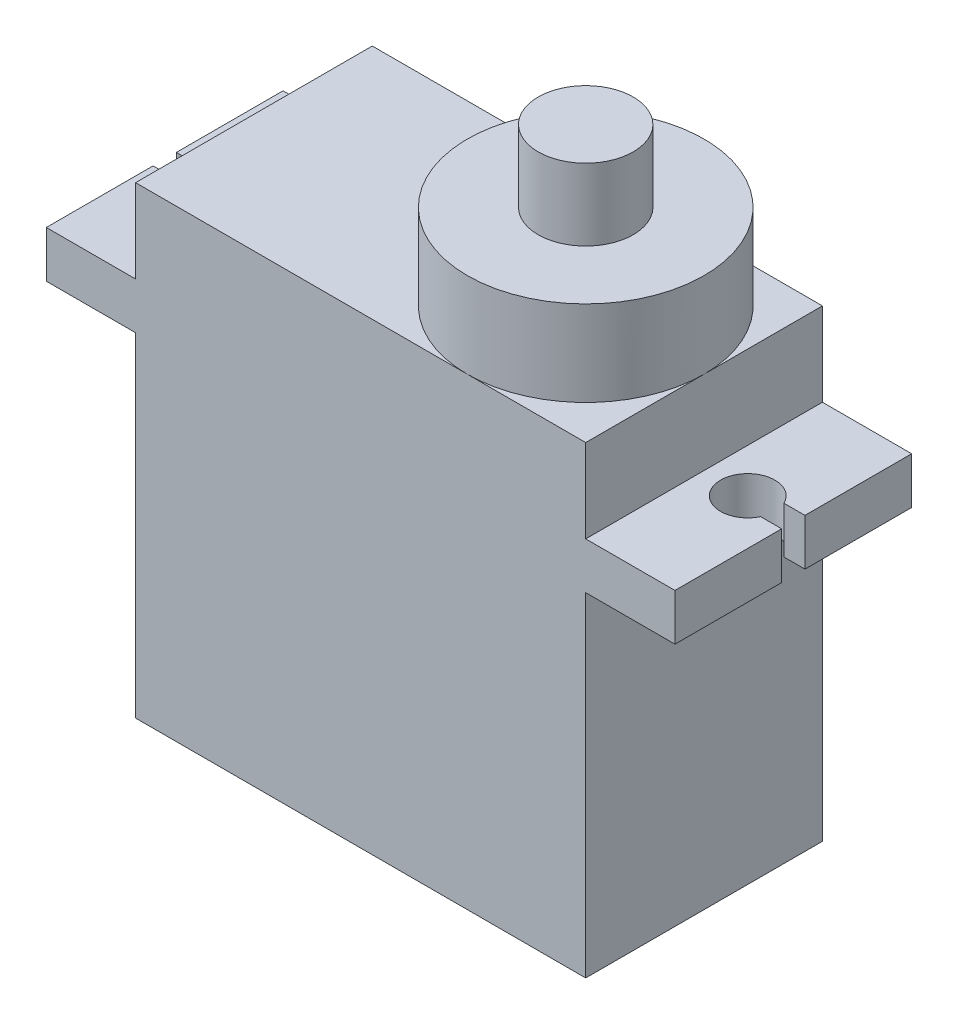
ISO-10303-21;
HEADER;
FILE_DESCRIPTION(('STEP AP214'),'2;1');
FILE_NAME('part.step','',(''),(''),'','','');
FILE_SCHEMA(('AUTOMOTIVE_DESIGN { 1 0 10303 214 1 1 1 1 }'));
ENDSEC;
DATA;
#1=APPLICATION_CONTEXT('core data for automotive mechanical design processes');
#2=APPLICATION_PROTOCOL_DEFINITION('international standard','automotive_design',2000,#1);
#3=PRODUCT_CONTEXT('',#1,'mechanical');
#4=PRODUCT('Part','Part','',(#3));
#5=PRODUCT_RELATED_PRODUCT_CATEGORY('part','',(#4));
#6=PRODUCT_DEFINITION_FORMATION('','',#4);
#7=PRODUCT_DEFINITION_CONTEXT('part definition',#1,'design');
#8=PRODUCT_DEFINITION('design','',#6,#7);
#9=PRODUCT_DEFINITION_SHAPE('','',#8);
#10=(LENGTH_UNIT() NAMED_UNIT(*) SI_UNIT(.MILLI.,.METRE.));
#11=(NAMED_UNIT(*) PLANE_ANGLE_UNIT() SI_UNIT($,.RADIAN.));
#12=(NAMED_UNIT(*) SI_UNIT($,.STERADIAN.) SOLID_ANGLE_UNIT());
#13=UNCERTAINTY_MEASURE_WITH_UNIT(LENGTH_MEASURE(1.E-05),#10,'distance_accuracy_value','');
#14=(GEOMETRIC_REPRESENTATION_CONTEXT(3) GLOBAL_UNCERTAINTY_ASSIGNED_CONTEXT((#13)) GLOBAL_UNIT_ASSIGNED_CONTEXT((#10,
#11,#12)) REPRESENTATION_CONTEXT('',''));
#15=CARTESIAN_POINT('',(0.,0.,0.));
#16=DIRECTION('',(0.,0.,1.));
#17=DIRECTION('',(1.,0.,0.));
#18=AXIS2_PLACEMENT_3D('',#15,#16,#17);
#19=CARTESIAN_POINT('',(0.,17.75234375,0.));
#20=DIRECTION('',(0.,1.,0.));
#21=DIRECTION('',(0.,0.,1.));
#22=AXIS2_PLACEMENT_3D('',#19,#20,#21);
#23=PLANE('',#22);
#24=CARTESIAN_POINT('',(13.0174479166667,17.75234375,6.1));
#25=DIRECTION('',(0.,1.,0.));
#26=DIRECTION('',(0.,0.,1.));
#27=AXIS2_PLACEMENT_3D('',#24,#25,#26);
#28=CIRCLE('',#27,6.1);
#29=CARTESIAN_POINT('',(13.0174479166667,17.75234375,12.2));
#30=VERTEX_POINT('',#29);
#31=CARTESIAN_POINT('',(19.1174479166667,17.75234375,6.1));
#32=VERTEX_POINT('',#31);
#33=EDGE_CURVE('E206',#30,#32,#28,.T.);
#34=ORIENTED_EDGE('',*,*,#33,.F.);
#35=DIRECTION('',(1.,0.,0.));
#36=VECTOR('',#35,1.);
#37=CARTESIAN_POINT('',(-4.08255208333333,17.75234375,12.2));
#38=LINE('',#37,#36);
#39=CARTESIAN_POINT('',(19.1174479166667,17.75234375,12.2));
#40=VERTEX_POINT('',#39);
#41=EDGE_CURVE('E193',#30,#40,#38,.T.);
#42=ORIENTED_EDGE('',*,*,#41,.T.);
#43=DIRECTION('',(0.,0.,-1.));
#44=VECTOR('',#43,1.);
#45=CARTESIAN_POINT('',(19.1174479166667,17.75234375,12.2));
#46=LINE('',#45,#44);
#47=EDGE_CURVE('E207',#40,#32,#46,.T.);
#48=ORIENTED_EDGE('',*,*,#47,.T.);
#49=EDGE_LOOP('',(#34,#42,#48));
#50=FACE_BOUND('',#49,.T.);
#51=ADVANCED_FACE('F38',(#50),#23,.T.);
#52=CARTESIAN_POINT('',(13.0174479166667,17.75234375,0.));
#53=VERTEX_POINT('',#52);
#54=EDGE_CURVE('E47',#32,#53,#28,.T.);
#55=ORIENTED_EDGE('',*,*,#54,.F.);
#56=CARTESIAN_POINT('',(19.1174479166667,17.75234375,0.));
#57=VERTEX_POINT('',#56);
#58=EDGE_CURVE('E192',#32,#57,#46,.T.);
#59=ORIENTED_EDGE('',*,*,#58,.T.);
#60=DIRECTION('',(-1.,0.,0.));
#61=VECTOR('',#60,1.);
#62=CARTESIAN_POINT('',(19.1174479166667,17.75234375,0.));
#63=LINE('',#62,#61);
#64=EDGE_CURVE('E220',#57,#53,#63,.T.);
#65=ORIENTED_EDGE('',*,*,#64,.T.);
#66=EDGE_LOOP('',(#55,#59,#65));
#67=FACE_BOUND('',#66,.T.);
#68=ADVANCED_FACE('F394',(#67),#23,.T.);
#69=CARTESIAN_POINT('',(0.,13.45234375,0.));
#70=DIRECTION('',(0.,1.,0.));
#71=DIRECTION('',(0.,0.,1.));
#72=AXIS2_PLACEMENT_3D('',#69,#70,#71);
#73=PLANE('',#72);
#74=DIRECTION('',(0.,0.,1.));
#75=VECTOR('',#74,1.);
#76=CARTESIAN_POINT('',(-4.08255208333333,13.45234375,0.));
#77=LINE('',#76,#75);
#78=CARTESIAN_POINT('',(-4.08255208333333,13.45234375,0.));
#79=VERTEX_POINT('',#78);
#80=CARTESIAN_POINT('',(-4.08255208333333,13.45234375,12.2));
#81=VERTEX_POINT('',#80);
#82=EDGE_CURVE('E223',#79,#81,#77,.T.);
#83=ORIENTED_EDGE('',*,*,#82,.F.);
#84=DIRECTION('',(-1.,0.,0.));
#85=VECTOR('',#84,1.);
#86=CARTESIAN_POINT('',(-8.68255208333334,13.45234375,0.));
#87=LINE('',#86,#85);
#88=CARTESIAN_POINT('',(-8.68255208333334,13.45234375,0.));
#89=VERTEX_POINT('',#88);
#90=EDGE_CURVE('E292',#79,#89,#87,.T.);
#91=ORIENTED_EDGE('',*,*,#90,.T.);
#92=DIRECTION('',(0.,0.,1.));
#93=VECTOR('',#92,1.);
#94=CARTESIAN_POINT('',(-8.68255208333334,13.45234375,0.));
#95=LINE('',#94,#93);
#96=CARTESIAN_POINT('',(-8.68255208333334,13.45234375,5.5));
#97=VERTEX_POINT('',#96);
#98=EDGE_CURVE('E281',#89,#97,#95,.T.);
#99=ORIENTED_EDGE('',*,*,#98,.T.);
#100=DIRECTION('',(-1.,0.,0.));
#101=VECTOR('',#100,1.);
#102=CARTESIAN_POINT('',(-8.87954761423529,13.45234375,5.5));
#103=LINE('',#102,#101);
#104=CARTESIAN_POINT('',(-7.59746314740069,13.45234375,5.5));
#105=VERTEX_POINT('',#104);
#106=EDGE_CURVE('E263',#105,#97,#103,.T.);
#107=ORIENTED_EDGE('',*,*,#106,.F.);
#108=CARTESIAN_POINT('',(-6.33255208333334,13.45234375,6.1));
#109=DIRECTION('',(0.,1.,0.));
#110=DIRECTION('',(0.,0.,-1.));
#111=AXIS2_PLACEMENT_3D('',#108,#109,#110);
#112=CIRCLE('',#111,1.4);
#113=CARTESIAN_POINT('',(-7.59746314740069,13.45234375,6.7));
#114=VERTEX_POINT('',#113);
#115=EDGE_CURVE('E246',#114,#105,#112,.T.);
#116=ORIENTED_EDGE('',*,*,#115,.F.);
#117=DIRECTION('',(1.,0.,0.));
#118=VECTOR('',#117,1.);
#119=CARTESIAN_POINT('',(-7.59746314740069,13.45234375,6.7));
#120=LINE('',#119,#118);
#121=CARTESIAN_POINT('',(-8.68255208333334,13.45234375,6.7));
#122=VERTEX_POINT('',#121);
#123=EDGE_CURVE('E257',#122,#114,#120,.T.);
#124=ORIENTED_EDGE('',*,*,#123,.F.);
#125=CARTESIAN_POINT('',(-8.68255208333334,13.45234375,12.2));
#126=VERTEX_POINT('',#125);
#127=EDGE_CURVE('E285',#122,#126,#95,.T.);
#128=ORIENTED_EDGE('',*,*,#127,.T.);
#129=DIRECTION('',(1.,0.,0.));
#130=VECTOR('',#129,1.);
#131=CARTESIAN_POINT('',(-8.68255208333334,13.45234375,12.2));
#132=LINE('',#131,#130);
#133=EDGE_CURVE('E286',#126,#81,#132,.T.);
#134=ORIENTED_EDGE('',*,*,#133,.T.);
#135=EDGE_LOOP('',(#83,#91,#99,#107,#116,#124,#128,#134));
#136=FACE_BOUND('',#135,.T.);
#137=ADVANCED_FACE('F382',(#136),#73,.T.);
#138=CARTESIAN_POINT('',(-8.68255208333334,13.45234375,0.));
#139=DIRECTION('',(1.,0.,0.));
#140=DIRECTION('',(0.,0.,-1.));
#141=AXIS2_PLACEMENT_3D('',#138,#139,#140);
#142=PLANE('',#141);
#143=ORIENTED_EDGE('',*,*,#127,.F.);
#144=DIRECTION('',(0.,-1.,0.));
#145=VECTOR('',#144,1.);
#146=CARTESIAN_POINT('',(-8.68255208333334,13.45234375,6.7));
#147=LINE('',#146,#145);
#148=CARTESIAN_POINT('',(-8.68255208333334,11.05234375,6.7));
#149=VERTEX_POINT('',#148);
#150=EDGE_CURVE('E271',#122,#149,#147,.T.);
#151=ORIENTED_EDGE('',*,*,#150,.T.);
#152=DIRECTION('',(0.,0.,1.));
#153=VECTOR('',#152,1.);
#154=CARTESIAN_POINT('',(-8.68255208333334,11.05234375,0.));
#155=LINE('',#154,#153);
#156=CARTESIAN_POINT('',(-8.68255208333334,11.05234375,12.2));
#157=VERTEX_POINT('',#156);
#158=EDGE_CURVE('E280',#149,#157,#155,.T.);
#159=ORIENTED_EDGE('',*,*,#158,.T.);
#160=DIRECTION('',(0.,-1.,0.));
#161=VECTOR('',#160,1.);
#162=CARTESIAN_POINT('',(-8.68255208333334,13.45234375,12.2));
#163=LINE('',#162,#161);
#164=EDGE_CURVE('E319',#126,#157,#163,.T.);
#165=ORIENTED_EDGE('',*,*,#164,.F.);
#166=EDGE_LOOP('',(#143,#151,#159,#165));
#167=FACE_BOUND('',#166,.T.);
#168=ADVANCED_FACE('F372',(#167),#142,.F.);
#169=CARTESIAN_POINT('',(23.7174479166667,13.45234375,0.));
#170=DIRECTION('',(-1.,0.,0.));
#171=DIRECTION('',(0.,0.,1.));
#172=AXIS2_PLACEMENT_3D('',#169,#170,#171);
#173=PLANE('',#172);
#174=DIRECTION('',(0.,0.,-1.));
#175=VECTOR('',#174,1.);
#176=CARTESIAN_POINT('',(23.7174479166667,13.45234375,0.));
#177=LINE('',#176,#175);
#178=CARTESIAN_POINT('',(23.7174479166667,13.45234375,5.5));
#179=VERTEX_POINT('',#178);
#180=CARTESIAN_POINT('',(23.7174479166667,13.45234375,0.));
#181=VERTEX_POINT('',#180);
#182=EDGE_CURVE('E288',#179,#181,#177,.T.);
#183=ORIENTED_EDGE('',*,*,#182,.F.);
#184=DIRECTION('',(0.,-1.,0.));
#185=VECTOR('',#184,1.);
#186=CARTESIAN_POINT('',(23.7174479166667,13.45234375,5.5));
#187=LINE('',#186,#185);
#188=CARTESIAN_POINT('',(23.7174479166667,11.05234375,5.5));
#189=VERTEX_POINT('',#188);
#190=EDGE_CURVE('E277',#179,#189,#187,.T.);
#191=ORIENTED_EDGE('',*,*,#190,.T.);
#192=DIRECTION('',(0.,0.,-1.));
#193=VECTOR('',#192,1.);
#194=CARTESIAN_POINT('',(23.7174479166667,11.05234375,0.));
#195=LINE('',#194,#193);
#196=CARTESIAN_POINT('',(23.7174479166667,11.05234375,0.));
#197=VERTEX_POINT('',#196);
#198=EDGE_CURVE('E303',#189,#197,#195,.T.);
#199=ORIENTED_EDGE('',*,*,#198,.T.);
#200=DIRECTION('',(0.,-1.,0.));
#201=VECTOR('',#200,1.);
#202=CARTESIAN_POINT('',(23.7174479166667,13.45234375,0.));
#203=LINE('',#202,#201);
#204=EDGE_CURVE('E313',#181,#197,#203,.T.);
#205=ORIENTED_EDGE('',*,*,#204,.F.);
#206=EDGE_LOOP('',(#183,#191,#199,#205));
#207=FACE_BOUND('',#206,.T.);
#208=ADVANCED_FACE('F443',(#207),#173,.F.);
#209=CARTESIAN_POINT('',(-4.08255208333333,11.05234375,12.2));
#210=DIRECTION('',(1.,0.,0.));
#211=DIRECTION('',(0.,1.,0.));
#212=AXIS2_PLACEMENT_3D('',#209,#210,#211);
#213=PLANE('',#212);
#214=DIRECTION('',(0.,-1.,0.));
#215=VECTOR('',#214,1.);
#216=CARTESIAN_POINT('',(-4.08255208333333,11.05234375,0.));
#217=LINE('',#216,#215);
#218=CARTESIAN_POINT('',(-4.08255208333333,11.05234375,0.));
#219=VERTEX_POINT('',#218);
#220=CARTESIAN_POINT('',(-4.08255208333333,-6.14765625,0.));
#221=VERTEX_POINT('',#220);
#222=EDGE_CURVE('E322',#219,#221,#217,.T.);
#223=ORIENTED_EDGE('',*,*,#222,.T.);
#224=DIRECTION('',(0.,0.,-1.));
#225=VECTOR('',#224,1.);
#226=CARTESIAN_POINT('',(-4.08255208333333,-6.14765625,12.2));
#227=LINE('',#226,#225);
#228=CARTESIAN_POINT('',(-4.08255208333333,-6.14765625,12.2));
#229=VERTEX_POINT('',#228);
#230=EDGE_CURVE('E343',#229,#221,#227,.T.);
#231=ORIENTED_EDGE('',*,*,#230,.F.);
#232=DIRECTION('',(0.,-1.,0.));
#233=VECTOR('',#232,1.);
#234=CARTESIAN_POINT('',(-4.08255208333333,11.05234375,12.2));
#235=LINE('',#234,#233);
#236=CARTESIAN_POINT('',(-4.08255208333333,11.05234375,12.2));
#237=VERTEX_POINT('',#236);
#238=EDGE_CURVE('E323',#237,#229,#235,.T.);
#239=ORIENTED_EDGE('',*,*,#238,.F.);
#240=DIRECTION('',(0.,0.,-1.));
#241=VECTOR('',#240,1.);
#242=CARTESIAN_POINT('',(-4.08255208333333,11.05234375,12.2));
#243=LINE('',#242,#241);
#244=EDGE_CURVE('E330',#237,#219,#243,.T.);
#245=ORIENTED_EDGE('',*,*,#244,.T.);
#246=EDGE_LOOP('',(#223,#231,#239,#245));
#247=FACE_BOUND('',#246,.T.);
#248=ADVANCED_FACE('F40',(#247),#213,.F.);
#249=CARTESIAN_POINT('',(-4.08255208333333,-6.14765625,12.2));
#250=DIRECTION('',(0.,1.,0.));
#251=DIRECTION('',(0.,0.,1.));
#252=AXIS2_PLACEMENT_3D('',#249,#250,#251);
#253=PLANE('',#252);
#254=DIRECTION('',(1.,0.,0.));
#255=VECTOR('',#254,1.);
#256=CARTESIAN_POINT('',(-4.08255208333333,-6.14765625,0.));
#257=LINE('',#256,#255);
#258=CARTESIAN_POINT('',(19.1174479166667,-6.14765625,0.));
#259=VERTEX_POINT('',#258);
#260=EDGE_CURVE('E333',#221,#259,#257,.T.);
#261=ORIENTED_EDGE('',*,*,#260,.T.);
#262=DIRECTION('',(0.,0.,-1.));
#263=VECTOR('',#262,1.);
#264=CARTESIAN_POINT('',(19.1174479166667,-6.14765625,12.2));
#265=LINE('',#264,#263);
#266=CARTESIAN_POINT('',(19.1174479166667,-6.14765625,12.2));
#267=VERTEX_POINT('',#266);
#268=EDGE_CURVE('E340',#267,#259,#265,.T.);
#269=ORIENTED_EDGE('',*,*,#268,.F.);
#270=DIRECTION('',(1.,0.,0.));
#271=VECTOR('',#270,1.);
#272=CARTESIAN_POINT('',(-4.08255208333333,-6.14765625,12.2));
#273=LINE('',#272,#271);
#274=EDGE_CURVE('E325',#229,#267,#273,.T.);
#275=ORIENTED_EDGE('',*,*,#274,.F.);
#276=ORIENTED_EDGE('',*,*,#230,.T.);
#277=EDGE_LOOP('',(#261,#269,#275,#276));
#278=FACE_BOUND('',#277,.T.);
#279=ADVANCED_FACE('F463',(#278),#253,.F.);
#280=CARTESIAN_POINT('',(19.1174479166667,11.05234375,12.2));
#281=DIRECTION('',(-1.,0.,0.));
#282=DIRECTION('',(0.,-1.,0.));
#283=AXIS2_PLACEMENT_3D('',#280,#281,#282);
#284=PLANE('',#283);
#285=DIRECTION('',(0.,1.,0.));
#286=VECTOR('',#285,1.);
#287=CARTESIAN_POINT('',(19.1174479166667,11.05234375,0.));
#288=LINE('',#287,#286);
#289=CARTESIAN_POINT('',(19.1174479166667,11.05234375,0.));
#290=VERTEX_POINT('',#289);
#291=EDGE_CURVE('E326',#259,#290,#288,.T.);
#292=ORIENTED_EDGE('',*,*,#291,.T.);
#293=DIRECTION('',(0.,0.,-1.));
#294=VECTOR('',#293,1.);
#295=CARTESIAN_POINT('',(19.1174479166667,11.05234375,12.2));
#296=LINE('',#295,#294);
#297=CARTESIAN_POINT('',(19.1174479166667,11.05234375,12.2));
#298=VERTEX_POINT('',#297);
#299=EDGE_CURVE('E337',#298,#290,#296,.T.);
#300=ORIENTED_EDGE('',*,*,#299,.F.);
#301=DIRECTION('',(0.,1.,0.));
#302=VECTOR('',#301,1.);
#303=CARTESIAN_POINT('',(19.1174479166667,11.05234375,12.2));
#304=LINE('',#303,#302);
#305=EDGE_CURVE('E328',#267,#298,#304,.T.);
#306=ORIENTED_EDGE('',*,*,#305,.F.);
#307=ORIENTED_EDGE('',*,*,#268,.T.);
#308=EDGE_LOOP('',(#292,#300,#306,#307));
#309=FACE_BOUND('',#308,.T.);
#310=ADVANCED_FACE('F460',(#309),#284,.F.);
#311=CARTESIAN_POINT('',(0.,0.,12.2));
#312=DIRECTION('',(0.,0.,1.));
#313=DIRECTION('',(1.,0.,0.));
#314=AXIS2_PLACEMENT_3D('',#311,#312,#313);
#315=PLANE('',#314);
#316=ORIENTED_EDGE('',*,*,#238,.T.);
#317=ORIENTED_EDGE('',*,*,#274,.T.);
#318=ORIENTED_EDGE('',*,*,#305,.T.);
#319=DIRECTION('',(1.,0.,0.));
#320=VECTOR('',#319,1.);
#321=CARTESIAN_POINT('',(-8.68255208333334,11.05234375,12.2));
#322=LINE('',#321,#320);
#323=CARTESIAN_POINT('',(23.7174479166667,11.05234375,12.2));
#324=VERTEX_POINT('',#323);
#325=EDGE_CURVE('E299',#298,#324,#322,.T.);
#326=ORIENTED_EDGE('',*,*,#325,.T.);
#327=DIRECTION('',(0.,-1.,0.));
#328=VECTOR('',#327,1.);
#329=CARTESIAN_POINT('',(23.7174479166667,13.45234375,12.2));
#330=LINE('',#329,#328);
#331=CARTESIAN_POINT('',(23.7174479166667,13.45234375,12.2));
#332=VERTEX_POINT('',#331);
#333=EDGE_CURVE('E316',#332,#324,#330,.T.);
#334=ORIENTED_EDGE('',*,*,#333,.F.);
#335=CARTESIAN_POINT('',(19.1174479166667,13.45234375,12.2));
#336=VERTEX_POINT('',#335);
#337=EDGE_CURVE('E284',#336,#332,#132,.T.);
#338=ORIENTED_EDGE('',*,*,#337,.F.);
#339=DIRECTION('',(0.,-1.,0.));
#340=VECTOR('',#339,1.);
#341=CARTESIAN_POINT('',(19.1174479166667,17.75234375,12.2));
#342=LINE('',#341,#340);
#343=EDGE_CURVE('E201',#40,#336,#342,.T.);
#344=ORIENTED_EDGE('',*,*,#343,.F.);
#345=ORIENTED_EDGE('',*,*,#41,.F.);
#346=CARTESIAN_POINT('',(-4.08255208333333,17.75234375,12.2));
#347=VERTEX_POINT('',#346);
#348=EDGE_CURVE('E184',#347,#30,#38,.T.);
#349=ORIENTED_EDGE('',*,*,#348,.F.);
#350=DIRECTION('',(0.,-1.,0.));
#351=VECTOR('',#350,1.);
#352=CARTESIAN_POINT('',(-4.08255208333333,17.75234375,12.2));
#353=LINE('',#352,#351);
#354=EDGE_CURVE('E234',#347,#81,#353,.T.);
#355=ORIENTED_EDGE('',*,*,#354,.T.);
#356=ORIENTED_EDGE('',*,*,#133,.F.);
#357=ORIENTED_EDGE('',*,*,#164,.T.);
#358=EDGE_CURVE('E300',#157,#237,#322,.T.);
#359=ORIENTED_EDGE('',*,*,#358,.T.);
#360=EDGE_LOOP('',(#316,#317,#318,#326,#334,#338,#344,#345,#349,#355,#356,#357,#359));
#361=FACE_BOUND('',#360,.T.);
#362=ADVANCED_FACE('F198',(#361),#315,.T.);
#363=CARTESIAN_POINT('',(0.,0.,0.));
#364=DIRECTION('',(0.,0.,1.));
#365=DIRECTION('',(1.,0.,0.));
#366=AXIS2_PLACEMENT_3D('',#363,#364,#365);
#367=PLANE('',#366);
#368=ORIENTED_EDGE('',*,*,#222,.F.);
#369=DIRECTION('',(-1.,0.,0.));
#370=VECTOR('',#369,1.);
#371=CARTESIAN_POINT('',(-8.68255208333334,11.05234375,0.));
#372=LINE('',#371,#370);
#373=CARTESIAN_POINT('',(-8.68255208333334,11.05234375,0.));
#374=VERTEX_POINT('',#373);
#375=EDGE_CURVE('E307',#219,#374,#372,.T.);
#376=ORIENTED_EDGE('',*,*,#375,.T.);
#377=DIRECTION('',(0.,-1.,0.));
#378=VECTOR('',#377,1.);
#379=CARTESIAN_POINT('',(-8.68255208333334,13.45234375,0.));
#380=LINE('',#379,#378);
#381=EDGE_CURVE('E295',#89,#374,#380,.T.);
#382=ORIENTED_EDGE('',*,*,#381,.F.);
#383=ORIENTED_EDGE('',*,*,#90,.F.);
#384=DIRECTION('',(0.,-1.,0.));
#385=VECTOR('',#384,1.);
#386=CARTESIAN_POINT('',(-4.08255208333333,17.75234375,0.));
#387=LINE('',#386,#385);
#388=CARTESIAN_POINT('',(-4.08255208333333,17.75234375,0.));
#389=VERTEX_POINT('',#388);
#390=EDGE_CURVE('E222',#389,#79,#387,.T.);
#391=ORIENTED_EDGE('',*,*,#390,.F.);
#392=EDGE_CURVE('E219',#53,#389,#63,.T.);
#393=ORIENTED_EDGE('',*,*,#392,.F.);
#394=ORIENTED_EDGE('',*,*,#64,.F.);
#395=DIRECTION('',(0.,-1.,0.));
#396=VECTOR('',#395,1.);
#397=CARTESIAN_POINT('',(19.1174479166667,17.75234375,0.));
#398=LINE('',#397,#396);
#399=CARTESIAN_POINT('',(19.1174479166667,13.45234375,0.));
#400=VERTEX_POINT('',#399);
#401=EDGE_CURVE('E230',#57,#400,#398,.T.);
#402=ORIENTED_EDGE('',*,*,#401,.T.);
#403=EDGE_CURVE('E293',#181,#400,#87,.T.);
#404=ORIENTED_EDGE('',*,*,#403,.F.);
#405=ORIENTED_EDGE('',*,*,#204,.T.);
#406=EDGE_CURVE('E308',#197,#290,#372,.T.);
#407=ORIENTED_EDGE('',*,*,#406,.T.);
#408=ORIENTED_EDGE('',*,*,#291,.F.);
#409=ORIENTED_EDGE('',*,*,#260,.F.);
#410=EDGE_LOOP('',(#368,#376,#382,#383,#391,#393,#394,#402,#404,#405,#407,#408,#409));
#411=FACE_BOUND('',#410,.T.);
#412=ADVANCED_FACE('F362',(#411),#367,.F.);
#413=CARTESIAN_POINT('',(0.,11.05234375,0.));
#414=DIRECTION('',(0.,1.,0.));
#415=DIRECTION('',(0.,0.,1.));
#416=AXIS2_PLACEMENT_3D('',#413,#414,#415);
#417=PLANE('',#416);
#418=ORIENTED_EDGE('',*,*,#198,.F.);
#419=DIRECTION('',(1.,0.,0.));
#420=VECTOR('',#419,1.);
#421=CARTESIAN_POINT('',(23.9144434475686,11.05234375,5.5));
#422=LINE('',#421,#420);
#423=CARTESIAN_POINT('',(22.632358980734,11.05234375,5.5));
#424=VERTEX_POINT('',#423);
#425=EDGE_CURVE('E237',#424,#189,#422,.T.);
#426=ORIENTED_EDGE('',*,*,#425,.F.);
#427=CARTESIAN_POINT('',(21.3674479166667,11.05234375,6.1));
#428=DIRECTION('',(0.,1.,0.));
#429=DIRECTION('',(0.,0.,1.));
#430=AXIS2_PLACEMENT_3D('',#427,#428,#429);
#431=CIRCLE('',#430,1.4);
#432=CARTESIAN_POINT('',(22.632358980734,11.05234375,6.7));
#433=VERTEX_POINT('',#432);
#434=EDGE_CURVE('E239',#433,#424,#431,.F.);
#435=ORIENTED_EDGE('',*,*,#434,.F.);
#436=DIRECTION('',(-1.,0.,0.));
#437=VECTOR('',#436,1.);
#438=CARTESIAN_POINT('',(22.632358980734,11.05234375,6.7));
#439=LINE('',#438,#437);
#440=CARTESIAN_POINT('',(23.7174479166667,11.05234375,6.7));
#441=VERTEX_POINT('',#440);
#442=EDGE_CURVE('E242',#441,#433,#439,.T.);
#443=ORIENTED_EDGE('',*,*,#442,.F.);
#444=EDGE_CURVE('E304',#324,#441,#195,.T.);
#445=ORIENTED_EDGE('',*,*,#444,.F.);
#446=ORIENTED_EDGE('',*,*,#325,.F.);
#447=ORIENTED_EDGE('',*,*,#299,.T.);
#448=ORIENTED_EDGE('',*,*,#406,.F.);
#449=EDGE_LOOP('',(#418,#426,#435,#443,#445,#446,#447,#448));
#450=FACE_BOUND('',#449,.T.);
#451=ADVANCED_FACE('F438',(#450),#417,.F.);
#452=CARTESIAN_POINT('',(-8.68255208333334,11.05234375,5.5));
#453=VERTEX_POINT('',#452);
#454=EDGE_CURVE('E296',#374,#453,#155,.T.);
#455=ORIENTED_EDGE('',*,*,#454,.T.);
#456=DIRECTION('',(0.,1.,0.));
#457=VECTOR('',#456,1.);
#458=CARTESIAN_POINT('',(-8.68255208333334,13.45234375,5.5));
#459=LINE('',#458,#457);
#460=EDGE_CURVE('E254',#453,#97,#459,.T.);
#461=ORIENTED_EDGE('',*,*,#460,.T.);
#462=ORIENTED_EDGE('',*,*,#98,.F.);
#463=ORIENTED_EDGE('',*,*,#381,.T.);
#464=EDGE_LOOP('',(#455,#461,#462,#463));
#465=FACE_BOUND('',#464,.T.);
#466=ADVANCED_FACE('F356',(#465),#142,.F.);
#467=ORIENTED_EDGE('',*,*,#444,.T.);
#468=DIRECTION('',(0.,1.,0.));
#469=VECTOR('',#468,1.);
#470=CARTESIAN_POINT('',(23.7174479166667,13.45234375,6.7));
#471=LINE('',#470,#469);
#472=CARTESIAN_POINT('',(23.7174479166667,13.45234375,6.7));
#473=VERTEX_POINT('',#472);
#474=EDGE_CURVE('E274',#441,#473,#471,.T.);
#475=ORIENTED_EDGE('',*,*,#474,.T.);
#476=EDGE_CURVE('E289',#332,#473,#177,.T.);
#477=ORIENTED_EDGE('',*,*,#476,.F.);
#478=ORIENTED_EDGE('',*,*,#333,.T.);
#479=EDGE_LOOP('',(#467,#475,#477,#478));
#480=FACE_BOUND('',#479,.T.);
#481=ADVANCED_FACE('F454',(#480),#173,.F.);
#482=DIRECTION('',(0.,0.,-1.));
#483=VECTOR('',#482,1.);
#484=CARTESIAN_POINT('',(19.1174479166667,13.45234375,12.2));
#485=LINE('',#484,#483);
#486=EDGE_CURVE('E216',#336,#400,#485,.T.);
#487=ORIENTED_EDGE('',*,*,#486,.F.);
#488=ORIENTED_EDGE('',*,*,#337,.T.);
#489=ORIENTED_EDGE('',*,*,#476,.T.);
#490=DIRECTION('',(1.,0.,0.));
#491=VECTOR('',#490,1.);
#492=CARTESIAN_POINT('',(22.632358980734,13.45234375,6.7));
#493=LINE('',#492,#491);
#494=CARTESIAN_POINT('',(22.632358980734,13.45234375,6.7));
#495=VERTEX_POINT('',#494);
#496=EDGE_CURVE('E245',#495,#473,#493,.T.);
#497=ORIENTED_EDGE('',*,*,#496,.F.);
#498=CARTESIAN_POINT('',(21.3674479166667,13.45234375,6.1));
#499=DIRECTION('',(0.,1.,0.));
#500=DIRECTION('',(0.,0.,1.));
#501=AXIS2_PLACEMENT_3D('',#498,#499,#500);
#502=CIRCLE('',#501,1.4);
#503=CARTESIAN_POINT('',(22.632358980734,13.45234375,5.5));
#504=VERTEX_POINT('',#503);
#505=EDGE_CURVE('E243',#504,#495,#502,.T.);
#506=ORIENTED_EDGE('',*,*,#505,.F.);
#507=DIRECTION('',(-1.,0.,0.));
#508=VECTOR('',#507,1.);
#509=CARTESIAN_POINT('',(0.,13.45234375,5.5));
#510=LINE('',#509,#508);
#511=EDGE_CURVE('E42',#179,#504,#510,.T.);
#512=ORIENTED_EDGE('',*,*,#511,.F.);
#513=ORIENTED_EDGE('',*,*,#182,.T.);
#514=ORIENTED_EDGE('',*,*,#403,.T.);
#515=EDGE_LOOP('',(#487,#488,#489,#497,#506,#512,#513,#514));
#516=FACE_BOUND('',#515,.T.);
#517=ADVANCED_FACE('F449',(#516),#73,.T.);
#518=ORIENTED_EDGE('',*,*,#158,.F.);
#519=DIRECTION('',(-1.,0.,0.));
#520=VECTOR('',#519,1.);
#521=CARTESIAN_POINT('',(-7.59746314740069,11.05234375,6.7));
#522=LINE('',#521,#520);
#523=CARTESIAN_POINT('',(-7.59746314740069,11.05234375,6.7));
#524=VERTEX_POINT('',#523);
#525=EDGE_CURVE('E261',#524,#149,#522,.T.);
#526=ORIENTED_EDGE('',*,*,#525,.F.);
#527=CARTESIAN_POINT('',(-6.33255208333334,11.05234375,6.1));
#528=DIRECTION('',(0.,1.,0.));
#529=DIRECTION('',(0.,0.,1.));
#530=AXIS2_PLACEMENT_3D('',#527,#528,#529);
#531=CIRCLE('',#530,1.4);
#532=CARTESIAN_POINT('',(-7.59746314740069,11.05234375,5.5));
#533=VERTEX_POINT('',#532);
#534=EDGE_CURVE('E236',#533,#524,#531,.F.);
#535=ORIENTED_EDGE('',*,*,#534,.F.);
#536=DIRECTION('',(-1.,0.,0.));
#537=VECTOR('',#536,1.);
#538=CARTESIAN_POINT('',(0.,11.05234375,5.5));
#539=LINE('',#538,#537);
#540=EDGE_CURVE('E213',#533,#453,#539,.T.);
#541=ORIENTED_EDGE('',*,*,#540,.T.);
#542=ORIENTED_EDGE('',*,*,#454,.F.);
#543=ORIENTED_EDGE('',*,*,#375,.F.);
#544=ORIENTED_EDGE('',*,*,#244,.F.);
#545=ORIENTED_EDGE('',*,*,#358,.F.);
#546=EDGE_LOOP('',(#518,#526,#535,#541,#542,#543,#544,#545));
#547=FACE_BOUND('',#546,.T.);
#548=ADVANCED_FACE('F350',(#547),#417,.F.);
#549=CARTESIAN_POINT('',(-7.59746314740069,6.21304899549703,6.7));
#550=DIRECTION('',(0.,0.,1.));
#551=DIRECTION('',(1.,0.,0.));
#552=AXIS2_PLACEMENT_3D('',#549,#550,#551);
#553=PLANE('',#552);
#554=ORIENTED_EDGE('',*,*,#123,.T.);
#555=DIRECTION('',(0.,1.,0.));
#556=VECTOR('',#555,1.);
#557=CARTESIAN_POINT('',(-7.59746314740069,6.21304899549703,6.7));
#558=LINE('',#557,#556);
#559=EDGE_CURVE('E258',#524,#114,#558,.T.);
#560=ORIENTED_EDGE('',*,*,#559,.F.);
#561=ORIENTED_EDGE('',*,*,#525,.T.);
#562=ORIENTED_EDGE('',*,*,#150,.F.);
#563=EDGE_LOOP('',(#554,#560,#561,#562));
#564=FACE_BOUND('',#563,.T.);
#565=ADVANCED_FACE('F375',(#564),#553,.F.);
#566=CARTESIAN_POINT('',(-8.87954761423529,6.21304899549703,5.5));
#567=DIRECTION('',(0.,0.,-1.));
#568=DIRECTION('',(-1.,0.,0.));
#569=AXIS2_PLACEMENT_3D('',#566,#567,#568);
#570=PLANE('',#569);
#571=ORIENTED_EDGE('',*,*,#540,.F.);
#572=DIRECTION('',(0.,1.,0.));
#573=VECTOR('',#572,1.);
#574=CARTESIAN_POINT('',(-7.59746314740069,6.21304899549703,5.5));
#575=LINE('',#574,#573);
#576=EDGE_CURVE('E255',#533,#105,#575,.T.);
#577=ORIENTED_EDGE('',*,*,#576,.T.);
#578=ORIENTED_EDGE('',*,*,#106,.T.);
#579=ORIENTED_EDGE('',*,*,#460,.F.);
#580=EDGE_LOOP('',(#571,#577,#578,#579));
#581=FACE_BOUND('',#580,.T.);
#582=ADVANCED_FACE('F383',(#581),#570,.F.);
#583=CARTESIAN_POINT('',(-6.33255208333334,6.21304899549703,6.1));
#584=DIRECTION('',(0.,1.,0.));
#585=DIRECTION('',(0.,0.,1.));
#586=AXIS2_PLACEMENT_3D('',#583,#584,#585);
#587=CYLINDRICAL_SURFACE('',#586,1.4);
#588=ORIENTED_EDGE('',*,*,#534,.T.);
#589=ORIENTED_EDGE('',*,*,#559,.T.);
#590=ORIENTED_EDGE('',*,*,#115,.T.);
#591=ORIENTED_EDGE('',*,*,#576,.F.);
#592=EDGE_LOOP('',(#588,#589,#590,#591));
#593=FACE_BOUND('',#592,.T.);
#594=ADVANCED_FACE('F379',(#593),#587,.F.);
#595=CARTESIAN_POINT('',(23.9144434475686,6.21304899549703,5.5));
#596=DIRECTION('',(0.,0.,-1.));
#597=DIRECTION('',(-1.,0.,0.));
#598=AXIS2_PLACEMENT_3D('',#595,#596,#597);
#599=PLANE('',#598);
#600=ORIENTED_EDGE('',*,*,#511,.T.);
#601=DIRECTION('',(0.,1.,0.));
#602=VECTOR('',#601,1.);
#603=CARTESIAN_POINT('',(22.632358980734,6.21304899549703,5.5));
#604=LINE('',#603,#602);
#605=EDGE_CURVE('E240',#424,#504,#604,.T.);
#606=ORIENTED_EDGE('',*,*,#605,.F.);
#607=ORIENTED_EDGE('',*,*,#425,.T.);
#608=ORIENTED_EDGE('',*,*,#190,.F.);
#609=EDGE_LOOP('',(#600,#606,#607,#608));
#610=FACE_BOUND('',#609,.T.);
#611=ADVANCED_FACE('F390',(#610),#599,.F.);
#612=CARTESIAN_POINT('',(22.632358980734,6.21304899549703,6.7));
#613=DIRECTION('',(0.,0.,1.));
#614=DIRECTION('',(1.,0.,0.));
#615=AXIS2_PLACEMENT_3D('',#612,#613,#614);
#616=PLANE('',#615);
#617=ORIENTED_EDGE('',*,*,#442,.T.);
#618=DIRECTION('',(0.,1.,0.));
#619=VECTOR('',#618,1.);
#620=CARTESIAN_POINT('',(22.632358980734,6.21304899549703,6.7));
#621=LINE('',#620,#619);
#622=EDGE_CURVE('E248',#433,#495,#621,.T.);
#623=ORIENTED_EDGE('',*,*,#622,.T.);
#624=ORIENTED_EDGE('',*,*,#496,.T.);
#625=ORIENTED_EDGE('',*,*,#474,.F.);
#626=EDGE_LOOP('',(#617,#623,#624,#625));
#627=FACE_BOUND('',#626,.T.);
#628=ADVANCED_FACE('F420',(#627),#616,.F.);
#629=CARTESIAN_POINT('',(21.3674479166667,6.21304899549703,6.1));
#630=DIRECTION('',(0.,1.,0.));
#631=DIRECTION('',(0.,0.,1.));
#632=AXIS2_PLACEMENT_3D('',#629,#630,#631);
#633=CYLINDRICAL_SURFACE('',#632,1.4);
#634=ORIENTED_EDGE('',*,*,#434,.T.);
#635=ORIENTED_EDGE('',*,*,#605,.T.);
#636=ORIENTED_EDGE('',*,*,#505,.T.);
#637=ORIENTED_EDGE('',*,*,#622,.F.);
#638=EDGE_LOOP('',(#634,#635,#636,#637));
#639=FACE_BOUND('',#638,.T.);
#640=ADVANCED_FACE('F414',(#639),#633,.F.);
#641=CARTESIAN_POINT('',(-4.08255208333333,17.75234375,0.));
#642=DIRECTION('',(1.,0.,0.));
#643=DIRECTION('',(0.,0.,-1.));
#644=AXIS2_PLACEMENT_3D('',#641,#642,#643);
#645=PLANE('',#644);
#646=ORIENTED_EDGE('',*,*,#82,.T.);
#647=ORIENTED_EDGE('',*,*,#354,.F.);
#648=DIRECTION('',(0.,0.,1.));
#649=VECTOR('',#648,1.);
#650=CARTESIAN_POINT('',(-4.08255208333333,17.75234375,0.));
#651=LINE('',#650,#649);
#652=EDGE_CURVE('E188',#389,#347,#651,.T.);
#653=ORIENTED_EDGE('',*,*,#652,.F.);
#654=ORIENTED_EDGE('',*,*,#390,.T.);
#655=EDGE_LOOP('',(#646,#647,#653,#654));
#656=FACE_BOUND('',#655,.T.);
#657=ADVANCED_FACE('F409',(#656),#645,.F.);
#658=CARTESIAN_POINT('',(19.1174479166667,17.75234375,12.2));
#659=DIRECTION('',(-1.,0.,0.));
#660=DIRECTION('',(0.,0.,1.));
#661=AXIS2_PLACEMENT_3D('',#658,#659,#660);
#662=PLANE('',#661);
#663=ORIENTED_EDGE('',*,*,#486,.T.);
#664=ORIENTED_EDGE('',*,*,#401,.F.);
#665=ORIENTED_EDGE('',*,*,#58,.F.);
#666=ORIENTED_EDGE('',*,*,#47,.F.);
#667=ORIENTED_EDGE('',*,*,#343,.T.);
#668=EDGE_LOOP('',(#663,#664,#665,#666,#667));
#669=FACE_BOUND('',#668,.T.);
#670=ADVANCED_FACE('F402',(#669),#662,.F.);
#671=EDGE_CURVE('E55',#53,#30,#28,.T.);
#672=ORIENTED_EDGE('',*,*,#671,.F.);
#673=ORIENTED_EDGE('',*,*,#392,.T.);
#674=ORIENTED_EDGE('',*,*,#652,.T.);
#675=ORIENTED_EDGE('',*,*,#348,.T.);
#676=EDGE_LOOP('',(#672,#673,#674,#675));
#677=FACE_BOUND('',#676,.T.);
#678=ADVANCED_FACE('F186',(#677),#23,.T.);
#679=CARTESIAN_POINT('',(13.0174479166667,22.15234375,6.1));
#680=DIRECTION('',(0.,-1.,0.));
#681=DIRECTION('',(0.,0.,-1.));
#682=AXIS2_PLACEMENT_3D('',#679,#680,#681);
#683=CYLINDRICAL_SURFACE('',#682,6.1);
#684=CARTESIAN_POINT('',(13.0174479166667,22.15234375,6.1));
#685=DIRECTION('',(0.,1.,0.));
#686=DIRECTION('',(0.,0.,1.));
#687=AXIS2_PLACEMENT_3D('',#684,#685,#686);
#688=CIRCLE('',#687,6.1);
#689=CARTESIAN_POINT('',(13.0174479166667,22.15234375,12.2));
#690=VERTEX_POINT('',#689);
#691=EDGE_CURVE('E209',#690,#690,#688,.T.);
#692=ORIENTED_EDGE('',*,*,#691,.F.);
#693=EDGE_LOOP('',(#692));
#694=FACE_BOUND('',#693,.T.);
#695=ORIENTED_EDGE('',*,*,#33,.T.);
#696=ORIENTED_EDGE('',*,*,#54,.T.);
#697=ORIENTED_EDGE('',*,*,#671,.T.);
#698=EDGE_LOOP('',(#695,#696,#697));
#699=FACE_BOUND('',#698,.T.);
#700=ADVANCED_FACE('F212',(#694,#699),#683,.T.);
#701=CARTESIAN_POINT('',(13.0174479166667,22.15234375,6.1));
#702=DIRECTION('',(0.,1.,0.));
#703=DIRECTION('',(0.,0.,1.));
#704=AXIS2_PLACEMENT_3D('',#701,#702,#703);
#705=PLANE('',#704);
#706=CARTESIAN_POINT('',(13.0174479166667,22.15234375,6.1));
#707=DIRECTION('',(0.,1.,0.));
#708=DIRECTION('',(0.,0.,1.));
#709=AXIS2_PLACEMENT_3D('',#706,#707,#708);
#710=CIRCLE('',#709,2.45);
#711=CARTESIAN_POINT('',(13.0174479166667,22.15234375,8.55));
#712=VERTEX_POINT('',#711);
#713=EDGE_CURVE('E11',#712,#712,#710,.T.);
#714=ORIENTED_EDGE('',*,*,#713,.F.);
#715=EDGE_LOOP('',(#714));
#716=FACE_BOUND('',#715,.T.);
#717=ORIENTED_EDGE('',*,*,#691,.T.);
#718=EDGE_LOOP('',(#717));
#719=FACE_BOUND('',#718,.T.);
#720=ADVANCED_FACE('F407',(#716,#719),#705,.T.);
#721=CARTESIAN_POINT('',(13.0174479166667,25.85234375,6.1));
#722=DIRECTION('',(0.,-1.,0.));
#723=DIRECTION('',(0.,0.,-1.));
#724=AXIS2_PLACEMENT_3D('',#721,#722,#723);
#725=CYLINDRICAL_SURFACE('',#724,2.45);
#726=CARTESIAN_POINT('',(13.0174479166667,25.85234375,6.1));
#727=DIRECTION('',(0.,1.,0.));
#728=DIRECTION('',(0.,0.,1.));
#729=AXIS2_PLACEMENT_3D('',#726,#727,#728);
#730=CIRCLE('',#729,2.45);
#731=CARTESIAN_POINT('',(13.0174479166667,25.85234375,8.55));
#732=VERTEX_POINT('',#731);
#733=EDGE_CURVE('E210',#732,#732,#730,.T.);
#734=ORIENTED_EDGE('',*,*,#733,.F.);
#735=EDGE_LOOP('',(#734));
#736=FACE_BOUND('',#735,.T.);
#737=ORIENTED_EDGE('',*,*,#713,.T.);
#738=EDGE_LOOP('',(#737));
#739=FACE_BOUND('',#738,.T.);
#740=ADVANCED_FACE('F624',(#736,#739),#725,.T.);
#741=CARTESIAN_POINT('',(13.0174479166667,25.85234375,6.1));
#742=DIRECTION('',(0.,1.,0.));
#743=DIRECTION('',(0.,0.,1.));
#744=AXIS2_PLACEMENT_3D('',#741,#742,#743);
#745=PLANE('',#744);
#746=ORIENTED_EDGE('',*,*,#733,.T.);
#747=EDGE_LOOP('',(#746));
#748=FACE_BOUND('',#747,.T.);
#749=ADVANCED_FACE('F634',(#748),#745,.T.);
#750=CLOSED_SHELL('',(#51,#68,#137,#168,#208,#248,#279,#310,#362,#412,#451,#466,#481,#517,#548,
#565,#582,#594,#611,#628,#640,#657,#670,#678,#700,#720,#740,#749));
#751=MANIFOLD_SOLID_BREP('B2',#750);
#752=ADVANCED_BREP_SHAPE_REPRESENTATION('',(#18,#751),#14);
#753=SHAPE_DEFINITION_REPRESENTATION(#9,#752);
ENDSEC;
END-ISO-10303-21;
